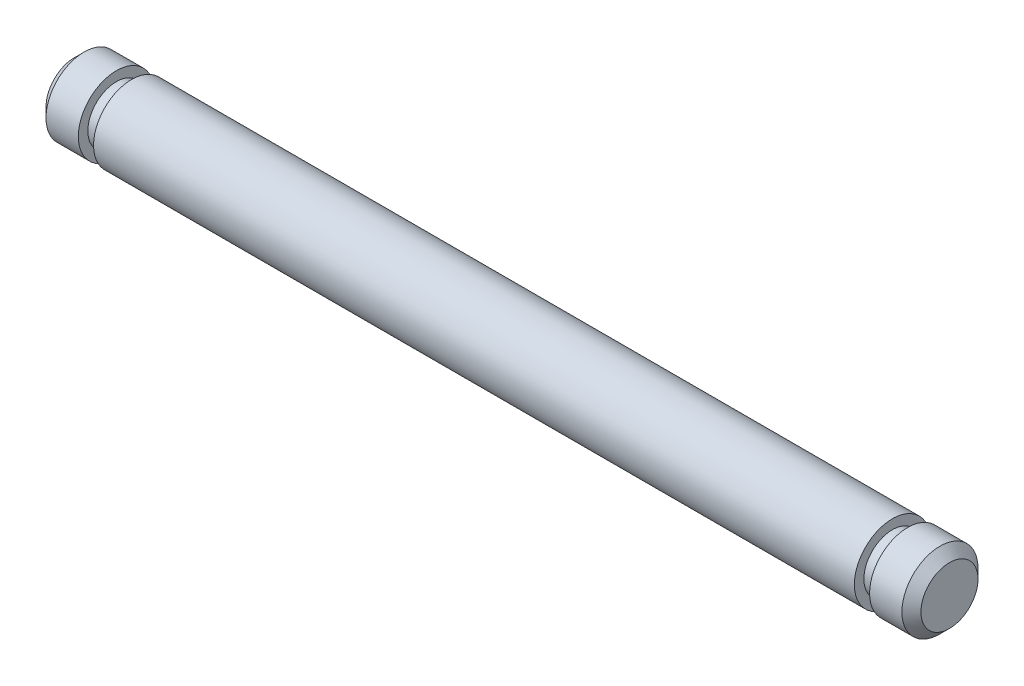
ISO-10303-21;
HEADER;
FILE_DESCRIPTION(('STEP AP214'),'2;1');
FILE_NAME('part.step','',(''),(''),'','','');
FILE_SCHEMA(('AUTOMOTIVE_DESIGN { 1 0 10303 214 1 1 1 1 }'));
ENDSEC;
DATA;
#1=APPLICATION_CONTEXT('core data for automotive mechanical design processes');
#2=APPLICATION_PROTOCOL_DEFINITION('international standard','automotive_design',2000,#1);
#3=PRODUCT_CONTEXT('',#1,'mechanical');
#4=PRODUCT('Part','Part','',(#3));
#5=PRODUCT_RELATED_PRODUCT_CATEGORY('part','',(#4));
#6=PRODUCT_DEFINITION_FORMATION('','',#4);
#7=PRODUCT_DEFINITION_CONTEXT('part definition',#1,'design');
#8=PRODUCT_DEFINITION('design','',#6,#7);
#9=PRODUCT_DEFINITION_SHAPE('','',#8);
#10=(LENGTH_UNIT() NAMED_UNIT(*) SI_UNIT(.MILLI.,.METRE.));
#11=(NAMED_UNIT(*) PLANE_ANGLE_UNIT() SI_UNIT($,.RADIAN.));
#12=(NAMED_UNIT(*) SI_UNIT($,.STERADIAN.) SOLID_ANGLE_UNIT());
#13=UNCERTAINTY_MEASURE_WITH_UNIT(LENGTH_MEASURE(1.E-05),#10,'distance_accuracy_value','');
#14=(GEOMETRIC_REPRESENTATION_CONTEXT(3) GLOBAL_UNCERTAINTY_ASSIGNED_CONTEXT((#13)) GLOBAL_UNIT_ASSIGNED_CONTEXT((#10,
#11,#12)) REPRESENTATION_CONTEXT('',''));
#15=CARTESIAN_POINT('',(0.,0.,0.));
#16=DIRECTION('',(0.,0.,1.));
#17=DIRECTION('',(1.,0.,0.));
#18=AXIS2_PLACEMENT_3D('',#15,#16,#17);
#19=CARTESIAN_POINT('',(23.,0.,0.));
#20=DIRECTION('',(-1.,0.,0.));
#21=DIRECTION('',(0.,0.,1.));
#22=AXIS2_PLACEMENT_3D('',#19,#20,#21);
#23=CYLINDRICAL_SURFACE('',#22,2.);
#24=CARTESIAN_POINT('',(-20.,0.,0.));
#25=DIRECTION('',(-1.,0.,0.));
#26=DIRECTION('',(0.,0.,1.));
#27=AXIS2_PLACEMENT_3D('',#24,#25,#26);
#28=CIRCLE('',#27,2.);
#29=CARTESIAN_POINT('',(-20.,0.,2.));
#30=VERTEX_POINT('',#29);
#31=EDGE_CURVE('E52',#30,#30,#28,.T.);
#32=ORIENTED_EDGE('',*,*,#31,.F.);
#33=EDGE_LOOP('',(#32));
#34=FACE_BOUND('',#33,.T.);
#35=CARTESIAN_POINT('',(20.,0.,0.));
#36=DIRECTION('',(-1.,0.,0.));
#37=DIRECTION('',(0.,0.,1.));
#38=AXIS2_PLACEMENT_3D('',#35,#36,#37);
#39=CIRCLE('',#38,2.);
#40=CARTESIAN_POINT('',(20.,0.,2.));
#41=VERTEX_POINT('',#40);
#42=EDGE_CURVE('E64',#41,#41,#39,.T.);
#43=ORIENTED_EDGE('',*,*,#42,.T.);
#44=EDGE_LOOP('',(#43));
#45=FACE_BOUND('',#44,.T.);
#46=ADVANCED_FACE('F31',(#34,#45),#23,.T.);
#47=CARTESIAN_POINT('',(-20.8,0.,0.));
#48=DIRECTION('',(-1.,0.,0.));
#49=DIRECTION('',(0.,0.,1.));
#50=AXIS2_PLACEMENT_3D('',#47,#48,#49);
#51=CIRCLE('',#50,2.);
#52=CARTESIAN_POINT('',(-20.8,0.,2.));
#53=VERTEX_POINT('',#52);
#54=EDGE_CURVE('E51',#53,#53,#51,.T.);
#55=ORIENTED_EDGE('',*,*,#54,.T.);
#56=EDGE_LOOP('',(#55));
#57=FACE_BOUND('',#56,.T.);
#58=CARTESIAN_POINT('',(-22.5,0.,0.));
#59=DIRECTION('',(1.,0.,0.));
#60=DIRECTION('',(0.,0.,-1.));
#61=AXIS2_PLACEMENT_3D('',#58,#59,#60);
#62=CIRCLE('',#61,2.);
#63=CARTESIAN_POINT('',(-22.5,0.,-2.));
#64=VERTEX_POINT('',#63);
#65=EDGE_CURVE('E42',#64,#64,#62,.T.);
#66=ORIENTED_EDGE('',*,*,#65,.T.);
#67=EDGE_LOOP('',(#66));
#68=FACE_BOUND('',#67,.T.);
#69=ADVANCED_FACE('F91',(#57,#68),#23,.T.);
#70=CARTESIAN_POINT('',(-23.,0.,0.));
#71=DIRECTION('',(1.,0.,0.));
#72=DIRECTION('',(0.,0.,-1.));
#73=AXIS2_PLACEMENT_3D('',#70,#71,#72);
#74=PLANE('',#73);
#75=CARTESIAN_POINT('',(-23.,0.,0.));
#76=DIRECTION('',(1.,0.,0.));
#77=DIRECTION('',(0.,0.,-1.));
#78=AXIS2_PLACEMENT_3D('',#75,#76,#77);
#79=CIRCLE('',#78,1.5);
#80=CARTESIAN_POINT('',(-23.,0.,-1.5));
#81=VERTEX_POINT('',#80);
#82=EDGE_CURVE('E38',#81,#81,#79,.F.);
#83=ORIENTED_EDGE('',*,*,#82,.T.);
#84=EDGE_LOOP('',(#83));
#85=FACE_BOUND('',#84,.T.);
#86=ADVANCED_FACE('F106',(#85),#74,.F.);
#87=CARTESIAN_POINT('',(-22.5,0.,0.));
#88=DIRECTION('',(1.,0.,0.));
#89=DIRECTION('',(0.,0.,-1.));
#90=AXIS2_PLACEMENT_3D('',#87,#88,#89);
#91=CONICAL_SURFACE('',#90,2.,0.785398163397453);
#92=ORIENTED_EDGE('',*,*,#82,.F.);
#93=EDGE_LOOP('',(#92));
#94=FACE_BOUND('',#93,.T.);
#95=ORIENTED_EDGE('',*,*,#65,.F.);
#96=EDGE_LOOP('',(#95));
#97=FACE_BOUND('',#96,.T.);
#98=ADVANCED_FACE('F111',(#94,#97),#91,.T.);
#99=CARTESIAN_POINT('',(-20.8,0.,0.));
#100=DIRECTION('',(-1.,0.,0.));
#101=DIRECTION('',(0.,0.,1.));
#102=AXIS2_PLACEMENT_3D('',#99,#100,#101);
#103=PLANE('',#102);
#104=ORIENTED_EDGE('',*,*,#54,.F.);
#105=EDGE_LOOP('',(#104));
#106=FACE_BOUND('',#105,.T.);
#107=CARTESIAN_POINT('',(-20.8,0.,0.));
#108=DIRECTION('',(-1.,0.,0.));
#109=DIRECTION('',(0.,0.,1.));
#110=AXIS2_PLACEMENT_3D('',#107,#108,#109);
#111=CIRCLE('',#110,1.5);
#112=CARTESIAN_POINT('',(-20.8,0.,1.5));
#113=VERTEX_POINT('',#112);
#114=EDGE_CURVE('E55',#113,#113,#111,.T.);
#115=ORIENTED_EDGE('',*,*,#114,.T.);
#116=EDGE_LOOP('',(#115));
#117=FACE_BOUND('',#116,.T.);
#118=ADVANCED_FACE('F113',(#106,#117),#103,.F.);
#119=CARTESIAN_POINT('',(-20.,0.,0.));
#120=DIRECTION('',(-1.,0.,0.));
#121=DIRECTION('',(0.,0.,1.));
#122=AXIS2_PLACEMENT_3D('',#119,#120,#121);
#123=PLANE('',#122);
#124=ORIENTED_EDGE('',*,*,#31,.T.);
#125=EDGE_LOOP('',(#124));
#126=FACE_BOUND('',#125,.T.);
#127=CARTESIAN_POINT('',(-20.,0.,0.));
#128=DIRECTION('',(-1.,0.,0.));
#129=DIRECTION('',(0.,0.,1.));
#130=AXIS2_PLACEMENT_3D('',#127,#128,#129);
#131=CIRCLE('',#130,1.5);
#132=CARTESIAN_POINT('',(-20.,0.,1.5));
#133=VERTEX_POINT('',#132);
#134=EDGE_CURVE('E58',#133,#133,#131,.T.);
#135=ORIENTED_EDGE('',*,*,#134,.F.);
#136=EDGE_LOOP('',(#135));
#137=FACE_BOUND('',#136,.T.);
#138=ADVANCED_FACE('F119',(#126,#137),#123,.T.);
#139=CARTESIAN_POINT('',(-20.8,0.,0.));
#140=DIRECTION('',(1.,0.,0.));
#141=DIRECTION('',(0.,0.,-1.));
#142=AXIS2_PLACEMENT_3D('',#139,#140,#141);
#143=CYLINDRICAL_SURFACE('',#142,1.5);
#144=ORIENTED_EDGE('',*,*,#114,.F.);
#145=EDGE_LOOP('',(#144));
#146=FACE_BOUND('',#145,.T.);
#147=ORIENTED_EDGE('',*,*,#134,.T.);
#148=EDGE_LOOP('',(#147));
#149=FACE_BOUND('',#148,.T.);
#150=ADVANCED_FACE('F83',(#146,#149),#143,.T.);
#151=CARTESIAN_POINT('',(20.8,0.,0.));
#152=DIRECTION('',(1.,0.,0.));
#153=DIRECTION('',(0.,0.,1.));
#154=AXIS2_PLACEMENT_3D('',#151,#152,#153);
#155=PLANE('',#154);
#156=CARTESIAN_POINT('',(20.8,0.,0.));
#157=DIRECTION('',(-1.,0.,0.));
#158=DIRECTION('',(0.,0.,1.));
#159=AXIS2_PLACEMENT_3D('',#156,#157,#158);
#160=CIRCLE('',#159,1.5);
#161=CARTESIAN_POINT('',(20.8,0.,1.5));
#162=VERTEX_POINT('',#161);
#163=EDGE_CURVE('E67',#162,#162,#160,.T.);
#164=ORIENTED_EDGE('',*,*,#163,.F.);
#165=EDGE_LOOP('',(#164));
#166=FACE_BOUND('',#165,.T.);
#167=CARTESIAN_POINT('',(20.8,0.,0.));
#168=DIRECTION('',(-1.,0.,0.));
#169=DIRECTION('',(0.,0.,1.));
#170=AXIS2_PLACEMENT_3D('',#167,#168,#169);
#171=CIRCLE('',#170,2.);
#172=CARTESIAN_POINT('',(20.8,0.,2.));
#173=VERTEX_POINT('',#172);
#174=EDGE_CURVE('E61',#173,#173,#171,.T.);
#175=ORIENTED_EDGE('',*,*,#174,.T.);
#176=EDGE_LOOP('',(#175));
#177=FACE_BOUND('',#176,.T.);
#178=ADVANCED_FACE('F79',(#166,#177),#155,.F.);
#179=CARTESIAN_POINT('',(20.,0.,0.));
#180=DIRECTION('',(1.,0.,0.));
#181=DIRECTION('',(0.,0.,1.));
#182=AXIS2_PLACEMENT_3D('',#179,#180,#181);
#183=PLANE('',#182);
#184=CARTESIAN_POINT('',(20.,0.,0.));
#185=DIRECTION('',(-1.,0.,0.));
#186=DIRECTION('',(0.,0.,1.));
#187=AXIS2_PLACEMENT_3D('',#184,#185,#186);
#188=CIRCLE('',#187,1.5);
#189=CARTESIAN_POINT('',(20.,0.,1.5));
#190=VERTEX_POINT('',#189);
#191=EDGE_CURVE('E70',#190,#190,#188,.T.);
#192=ORIENTED_EDGE('',*,*,#191,.T.);
#193=EDGE_LOOP('',(#192));
#194=FACE_BOUND('',#193,.T.);
#195=ORIENTED_EDGE('',*,*,#42,.F.);
#196=EDGE_LOOP('',(#195));
#197=FACE_BOUND('',#196,.T.);
#198=ADVANCED_FACE('F82',(#194,#197),#183,.T.);
#199=CARTESIAN_POINT('',(20.8,0.,0.));
#200=DIRECTION('',(-1.,0.,0.));
#201=DIRECTION('',(0.,0.,1.));
#202=AXIS2_PLACEMENT_3D('',#199,#200,#201);
#203=CYLINDRICAL_SURFACE('',#202,1.5);
#204=ORIENTED_EDGE('',*,*,#163,.T.);
#205=EDGE_LOOP('',(#204));
#206=FACE_BOUND('',#205,.T.);
#207=ORIENTED_EDGE('',*,*,#191,.F.);
#208=EDGE_LOOP('',(#207));
#209=FACE_BOUND('',#208,.T.);
#210=ADVANCED_FACE('F76',(#206,#209),#203,.T.);
#211=CARTESIAN_POINT('',(23.,0.,0.));
#212=DIRECTION('',(1.,0.,0.));
#213=DIRECTION('',(0.,0.,-1.));
#214=AXIS2_PLACEMENT_3D('',#211,#212,#213);
#215=PLANE('',#214);
#216=CARTESIAN_POINT('',(23.,0.,0.));
#217=DIRECTION('',(1.,0.,0.));
#218=DIRECTION('',(0.,0.,-1.));
#219=AXIS2_PLACEMENT_3D('',#216,#217,#218);
#220=CIRCLE('',#219,1.49999999999999);
#221=CARTESIAN_POINT('',(23.,0.,-1.49999999999999));
#222=VERTEX_POINT('',#221);
#223=EDGE_CURVE('E10',#222,#222,#220,.T.);
#224=ORIENTED_EDGE('',*,*,#223,.T.);
#225=EDGE_LOOP('',(#224));
#226=FACE_BOUND('',#225,.T.);
#227=ADVANCED_FACE('F96',(#226),#215,.T.);
#228=CARTESIAN_POINT('',(23.,0.,0.));
#229=DIRECTION('',(-1.,0.,0.));
#230=DIRECTION('',(0.,0.,1.));
#231=AXIS2_PLACEMENT_3D('',#228,#229,#230);
#232=CONICAL_SURFACE('',#231,1.49999999999999,0.785398163397453);
#233=CARTESIAN_POINT('',(22.5,0.,0.));
#234=DIRECTION('',(1.,0.,0.));
#235=DIRECTION('',(0.,0.,-1.));
#236=AXIS2_PLACEMENT_3D('',#233,#234,#235);
#237=CIRCLE('',#236,2.);
#238=CARTESIAN_POINT('',(22.5,0.,-2.));
#239=VERTEX_POINT('',#238);
#240=EDGE_CURVE('E46',#239,#239,#237,.F.);
#241=ORIENTED_EDGE('',*,*,#240,.F.);
#242=EDGE_LOOP('',(#241));
#243=FACE_BOUND('',#242,.T.);
#244=ORIENTED_EDGE('',*,*,#223,.F.);
#245=EDGE_LOOP('',(#244));
#246=FACE_BOUND('',#245,.T.);
#247=ADVANCED_FACE('F33',(#243,#246),#232,.T.);
#248=ORIENTED_EDGE('',*,*,#174,.F.);
#249=EDGE_LOOP('',(#248));
#250=FACE_BOUND('',#249,.T.);
#251=ORIENTED_EDGE('',*,*,#240,.T.);
#252=EDGE_LOOP('',(#251));
#253=FACE_BOUND('',#252,.T.);
#254=ADVANCED_FACE('F87',(#250,#253),#23,.T.);
#255=CLOSED_SHELL('',(#46,#69,#86,#98,#118,#138,#150,#178,#198,#210,#227,#247,#254));
#256=MANIFOLD_SOLID_BREP('B2',#255);
#257=ADVANCED_BREP_SHAPE_REPRESENTATION('',(#18,#256),#14);
#258=SHAPE_DEFINITION_REPRESENTATION(#9,#257);
ENDSEC;
END-ISO-10303-21;
